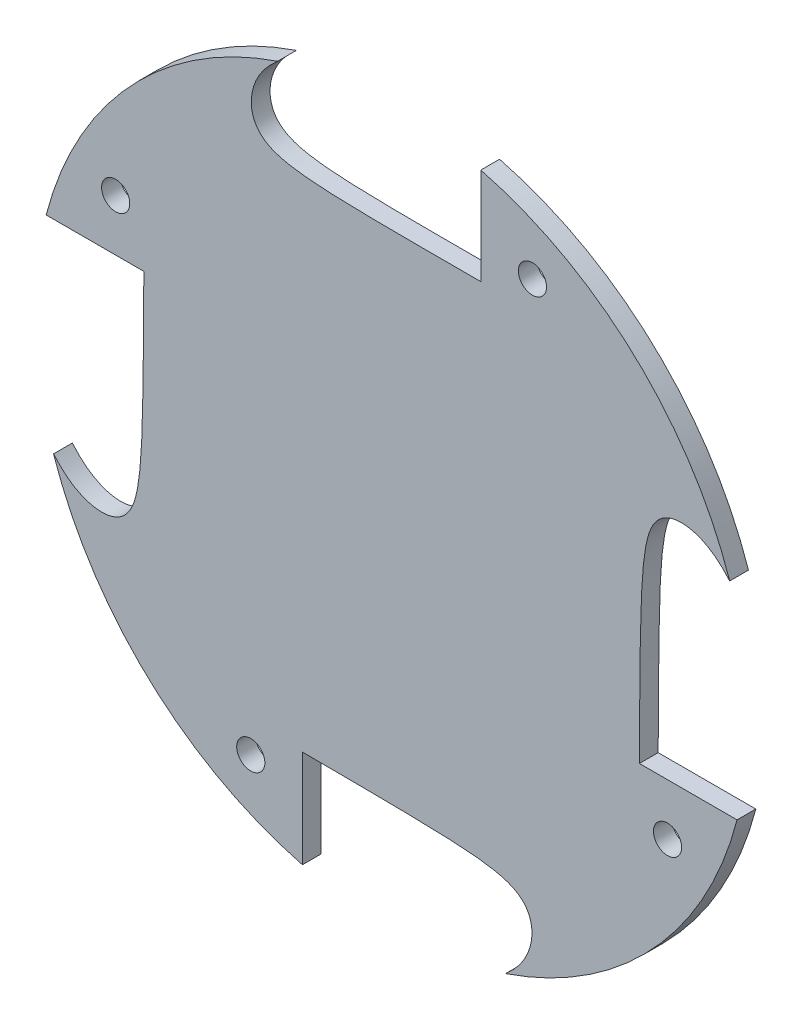
ISO-10303-21;
HEADER;
FILE_DESCRIPTION(('STEP AP214'),'2;1');
FILE_NAME('part.step','',(''),(''),'','','');
FILE_SCHEMA(('AUTOMOTIVE_DESIGN { 1 0 10303 214 1 1 1 1 }'));
ENDSEC;
DATA;
#1=APPLICATION_CONTEXT('core data for automotive mechanical design processes');
#2=APPLICATION_PROTOCOL_DEFINITION('international standard','automotive_design',2000,#1);
#3=PRODUCT_CONTEXT('',#1,'mechanical');
#4=PRODUCT('Part','Part','',(#3));
#5=PRODUCT_RELATED_PRODUCT_CATEGORY('part','',(#4));
#6=PRODUCT_DEFINITION_FORMATION('','',#4);
#7=PRODUCT_DEFINITION_CONTEXT('part definition',#1,'design');
#8=PRODUCT_DEFINITION('design','',#6,#7);
#9=PRODUCT_DEFINITION_SHAPE('','',#8);
#10=(LENGTH_UNIT() NAMED_UNIT(*) SI_UNIT(.MILLI.,.METRE.));
#11=(NAMED_UNIT(*) PLANE_ANGLE_UNIT() SI_UNIT($,.RADIAN.));
#12=(NAMED_UNIT(*) SI_UNIT($,.STERADIAN.) SOLID_ANGLE_UNIT());
#13=UNCERTAINTY_MEASURE_WITH_UNIT(LENGTH_MEASURE(1.E-05),#10,'distance_accuracy_value','');
#14=(GEOMETRIC_REPRESENTATION_CONTEXT(3) GLOBAL_UNCERTAINTY_ASSIGNED_CONTEXT((#13)) GLOBAL_UNIT_ASSIGNED_CONTEXT((#10,
#11,#12)) REPRESENTATION_CONTEXT('',''));
#15=CARTESIAN_POINT('',(0.,0.,0.));
#16=DIRECTION('',(0.,0.,1.));
#17=DIRECTION('',(1.,0.,0.));
#18=AXIS2_PLACEMENT_3D('',#15,#16,#17);
#19=CARTESIAN_POINT('',(24.2809901744275,-72.0168974349032,4.));
#20=CARTESIAN_POINT('',(27.0406670726884,-69.5410863292131,4.));
#21=CARTESIAN_POINT('',(29.0891629376006,-67.4285749685224,4.));
#22=CARTESIAN_POINT('',(30.2414418616137,-64.3558311711541,4.));
#23=CARTESIAN_POINT('',(31.0736433067342,-60.9630098948933,4.));
#24=CARTESIAN_POINT('',(30.5615193405061,-59.0425450215381,4.));
#25=CARTESIAN_POINT('',(29.2171939291575,-56.6739716777334,4.));
#26=CARTESIAN_POINT('',(27.4887755431378,-54.2413828381502,4.));
#27=CARTESIAN_POINT('',(25.1059549538443,-52.9999999999996,4.));
#28=CARTESIAN_POINT('',(17.3743272101338,-52.9999999999997,4.));
#29=CARTESIAN_POINT('',(-18.9999999999992,-52.782560411168,4.));
#30=B_SPLINE_CURVE_WITH_KNOTS('',10,(#19,#20,#21,#22,#23,#24,#25,#26,#27,#28,#29),.UNSPECIFIED.,
.F.,.F.,(11,11),(0.,1.),.UNSPECIFIED.);
#31=DIRECTION('',(0.,0.,-1.));
#32=VECTOR('',#31,1.);
#33=SURFACE_OF_LINEAR_EXTRUSION('',#30,#32);
#34=CARTESIAN_POINT('',(24.2809901744275,-72.0168974349032,0.));
#35=CARTESIAN_POINT('',(27.0406670726884,-69.5410863292131,0.));
#36=CARTESIAN_POINT('',(29.0891629376006,-67.4285749685224,0.));
#37=CARTESIAN_POINT('',(30.2414418616137,-64.3558311711541,0.));
#38=CARTESIAN_POINT('',(31.0736433067342,-60.9630098948933,0.));
#39=CARTESIAN_POINT('',(30.5615193405061,-59.0425450215381,0.));
#40=CARTESIAN_POINT('',(29.2171939291575,-56.6739716777334,0.));
#41=CARTESIAN_POINT('',(27.4887755431378,-54.2413828381502,0.));
#42=CARTESIAN_POINT('',(25.1059549538443,-52.9999999999996,0.));
#43=CARTESIAN_POINT('',(17.3743272101338,-52.9999999999997,0.));
#44=CARTESIAN_POINT('',(-18.9999999999992,-52.782560411168,0.));
#45=B_SPLINE_CURVE_WITH_KNOTS('',10,(#34,#35,#36,#37,#38,#39,#40,#41,#42,#43,#44),.UNSPECIFIED.,
.F.,.F.,(11,11),(0.,1.),.UNSPECIFIED.);
#46=CARTESIAN_POINT('',(24.2809901744275,-72.0168974349032,0.));
#47=VERTEX_POINT('',#46);
#48=CARTESIAN_POINT('',(-18.9999999999992,-52.782560411168,0.));
#49=VERTEX_POINT('',#48);
#50=EDGE_CURVE('E265',#47,#49,#45,.T.);
#51=ORIENTED_EDGE('',*,*,#50,.F.);
#52=DIRECTION('',(0.,0.,-1.));
#53=VECTOR('',#52,1.);
#54=CARTESIAN_POINT('',(24.2809901744275,-72.0168974349032,4.));
#55=LINE('',#54,#53);
#56=CARTESIAN_POINT('',(24.2809901744275,-72.0168974349032,4.));
#57=VERTEX_POINT('',#56);
#58=EDGE_CURVE('E11',#57,#47,#55,.T.);
#59=ORIENTED_EDGE('',*,*,#58,.F.);
#60=CARTESIAN_POINT('',(-18.9999999999992,-52.782560411168,4.));
#61=VERTEX_POINT('',#60);
#62=EDGE_CURVE('E321',#57,#61,#30,.T.);
#63=ORIENTED_EDGE('',*,*,#62,.T.);
#64=DIRECTION('',(0.,0.,-1.));
#65=VECTOR('',#64,1.);
#66=CARTESIAN_POINT('',(-18.9999999999992,-52.782560411168,4.));
#67=LINE('',#66,#65);
#68=EDGE_CURVE('E107',#61,#49,#67,.T.);
#69=ORIENTED_EDGE('',*,*,#68,.T.);
#70=EDGE_LOOP('',(#51,#59,#63,#69));
#71=FACE_BOUND('',#70,.T.);
#72=ADVANCED_FACE('F43',(#71),#33,.T.);
#73=CARTESIAN_POINT('',(0.,0.,4.));
#74=DIRECTION('',(0.,0.,-1.));
#75=DIRECTION('',(-1.,0.,0.));
#76=AXIS2_PLACEMENT_3D('',#73,#74,#75);
#77=CYLINDRICAL_SURFACE('',#76,76.);
#78=CARTESIAN_POINT('',(0.,0.,0.));
#79=DIRECTION('',(0.,0.,1.));
#80=DIRECTION('',(1.,0.,0.));
#81=AXIS2_PLACEMENT_3D('',#78,#79,#80);
#82=CIRCLE('',#81,76.);
#83=CARTESIAN_POINT('',(73.5866835779408,-19.0000000000005,0.));
#84=VERTEX_POINT('',#83);
#85=EDGE_CURVE('E255',#47,#84,#82,.T.);
#86=ORIENTED_EDGE('',*,*,#85,.T.);
#87=DIRECTION('',(0.,0.,-1.));
#88=VECTOR('',#87,1.);
#89=CARTESIAN_POINT('',(73.5866835779408,-19.0000000000005,4.));
#90=LINE('',#89,#88);
#91=CARTESIAN_POINT('',(73.5866835779408,-19.0000000000005,4.));
#92=VERTEX_POINT('',#91);
#93=EDGE_CURVE('E53',#92,#84,#90,.T.);
#94=ORIENTED_EDGE('',*,*,#93,.F.);
#95=CARTESIAN_POINT('',(0.,0.,4.));
#96=DIRECTION('',(0.,0.,1.));
#97=DIRECTION('',(1.,0.,0.));
#98=AXIS2_PLACEMENT_3D('',#95,#96,#97);
#99=CIRCLE('',#98,76.);
#100=EDGE_CURVE('E411',#57,#92,#99,.T.);
#101=ORIENTED_EDGE('',*,*,#100,.F.);
#102=ORIENTED_EDGE('',*,*,#58,.T.);
#103=EDGE_LOOP('',(#86,#94,#101,#102));
#104=FACE_BOUND('',#103,.T.);
#105=ADVANCED_FACE('F374',(#104),#77,.T.);
#106=CARTESIAN_POINT('',(0.,-19.0000000000005,4.));
#107=DIRECTION('',(0.,-1.,0.));
#108=DIRECTION('',(0.,0.,-1.));
#109=AXIS2_PLACEMENT_3D('',#106,#107,#108);
#110=PLANE('',#109);
#111=DIRECTION('',(-1.,0.,0.));
#112=VECTOR('',#111,1.);
#113=CARTESIAN_POINT('',(0.,-19.0000000000005,0.));
#114=LINE('',#113,#112);
#115=CARTESIAN_POINT('',(52.7825604111679,-19.0000000000005,0.));
#116=VERTEX_POINT('',#115);
#117=EDGE_CURVE('E246',#84,#116,#114,.T.);
#118=ORIENTED_EDGE('',*,*,#117,.T.);
#119=DIRECTION('',(0.,0.,-1.));
#120=VECTOR('',#119,1.);
#121=CARTESIAN_POINT('',(52.7825604111679,-19.0000000000005,4.));
#122=LINE('',#121,#120);
#123=CARTESIAN_POINT('',(52.7825604111679,-19.0000000000005,4.));
#124=VERTEX_POINT('',#123);
#125=EDGE_CURVE('E235',#124,#116,#122,.T.);
#126=ORIENTED_EDGE('',*,*,#125,.F.);
#127=DIRECTION('',(-1.,0.,0.));
#128=VECTOR('',#127,1.);
#129=CARTESIAN_POINT('',(0.,-19.0000000000005,4.));
#130=LINE('',#129,#128);
#131=EDGE_CURVE('E248',#92,#124,#130,.T.);
#132=ORIENTED_EDGE('',*,*,#131,.F.);
#133=ORIENTED_EDGE('',*,*,#93,.T.);
#134=EDGE_LOOP('',(#118,#126,#132,#133));
#135=FACE_BOUND('',#134,.T.);
#136=ADVANCED_FACE('F244',(#135),#110,.F.);
#137=CARTESIAN_POINT('',(72.0168974349034,24.2809901744259,4.));
#138=CARTESIAN_POINT('',(69.5410863292133,27.0406670726869,4.));
#139=CARTESIAN_POINT('',(67.4285749685226,29.0891629375991,4.));
#140=CARTESIAN_POINT('',(64.3558311711543,30.2414418616122,4.));
#141=CARTESIAN_POINT('',(60.9630098948935,31.0736433067328,4.));
#142=CARTESIAN_POINT('',(59.0425450215383,30.5615193405047,4.));
#143=CARTESIAN_POINT('',(56.6739716777336,29.217193929156,4.));
#144=CARTESIAN_POINT('',(54.2413828381504,27.4887755431363,4.));
#145=CARTESIAN_POINT('',(52.9999999999998,25.1059549538429,4.));
#146=CARTESIAN_POINT('',(52.9999999999999,17.3743272101324,4.));
#147=CARTESIAN_POINT('',(52.7825604111679,-19.0000000000005,4.));
#148=B_SPLINE_CURVE_WITH_KNOTS('',10,(#137,#138,#139,#140,#141,#142,#143,#144,#145,#146,#147),
.UNSPECIFIED.,.F.,.F.,(11,11),(0.,1.),.UNSPECIFIED.);
#149=DIRECTION('',(0.,0.,-1.));
#150=VECTOR('',#149,1.);
#151=SURFACE_OF_LINEAR_EXTRUSION('',#148,#150);
#152=CARTESIAN_POINT('',(72.0168974349034,24.2809901744259,0.));
#153=CARTESIAN_POINT('',(69.5410863292133,27.0406670726869,0.));
#154=CARTESIAN_POINT('',(67.4285749685226,29.0891629375991,0.));
#155=CARTESIAN_POINT('',(64.3558311711543,30.2414418616122,0.));
#156=CARTESIAN_POINT('',(60.9630098948935,31.0736433067328,0.));
#157=CARTESIAN_POINT('',(59.0425450215383,30.5615193405047,0.));
#158=CARTESIAN_POINT('',(56.6739716777336,29.217193929156,0.));
#159=CARTESIAN_POINT('',(54.2413828381504,27.4887755431363,0.));
#160=CARTESIAN_POINT('',(52.9999999999998,25.1059549538429,0.));
#161=CARTESIAN_POINT('',(52.9999999999999,17.3743272101324,0.));
#162=CARTESIAN_POINT('',(52.7825604111679,-19.0000000000005,0.));
#163=B_SPLINE_CURVE_WITH_KNOTS('',10,(#152,#153,#154,#155,#156,#157,#158,#159,#160,#161,#162),
.UNSPECIFIED.,.F.,.F.,(11,11),(0.,1.),.UNSPECIFIED.);
#164=CARTESIAN_POINT('',(72.0168974349035,24.280990174426,0.));
#165=VERTEX_POINT('',#164);
#166=EDGE_CURVE('E258',#165,#116,#163,.T.);
#167=ORIENTED_EDGE('',*,*,#166,.F.);
#168=DIRECTION('',(0.,0.,-1.));
#169=VECTOR('',#168,1.);
#170=CARTESIAN_POINT('',(72.0168974349035,24.280990174426,4.));
#171=LINE('',#170,#169);
#172=CARTESIAN_POINT('',(72.0168974349035,24.280990174426,4.));
#173=VERTEX_POINT('',#172);
#174=EDGE_CURVE('E232',#173,#165,#171,.T.);
#175=ORIENTED_EDGE('',*,*,#174,.F.);
#176=EDGE_CURVE('E388',#173,#124,#148,.T.);
#177=ORIENTED_EDGE('',*,*,#176,.T.);
#178=ORIENTED_EDGE('',*,*,#125,.T.);
#179=EDGE_LOOP('',(#167,#175,#177,#178));
#180=FACE_BOUND('',#179,.T.);
#181=ADVANCED_FACE('F381',(#180),#151,.T.);
#182=CARTESIAN_POINT('',(0.,0.,4.));
#183=DIRECTION('',(0.,0.,-1.));
#184=DIRECTION('',(-1.,0.,0.));
#185=AXIS2_PLACEMENT_3D('',#182,#183,#184);
#186=CYLINDRICAL_SURFACE('',#185,75.9999999999999);
#187=CARTESIAN_POINT('',(0.,0.,0.));
#188=DIRECTION('',(0.,0.,1.));
#189=DIRECTION('',(1.,0.,0.));
#190=AXIS2_PLACEMENT_3D('',#187,#188,#189);
#191=CIRCLE('',#190,75.9999999999999);
#192=CARTESIAN_POINT('',(19.0000000000008,73.5866835779407,0.));
#193=VERTEX_POINT('',#192);
#194=EDGE_CURVE('E263',#165,#193,#191,.T.);
#195=ORIENTED_EDGE('',*,*,#194,.T.);
#196=DIRECTION('',(0.,0.,-1.));
#197=VECTOR('',#196,1.);
#198=CARTESIAN_POINT('',(19.0000000000008,73.5866835779407,4.));
#199=LINE('',#198,#197);
#200=CARTESIAN_POINT('',(19.0000000000008,73.5866835779407,4.));
#201=VERTEX_POINT('',#200);
#202=EDGE_CURVE('E228',#201,#193,#199,.T.);
#203=ORIENTED_EDGE('',*,*,#202,.F.);
#204=CARTESIAN_POINT('',(0.,0.,4.));
#205=DIRECTION('',(0.,0.,1.));
#206=DIRECTION('',(1.,0.,0.));
#207=AXIS2_PLACEMENT_3D('',#204,#205,#206);
#208=CIRCLE('',#207,75.9999999999999);
#209=EDGE_CURVE('E395',#173,#201,#208,.T.);
#210=ORIENTED_EDGE('',*,*,#209,.F.);
#211=ORIENTED_EDGE('',*,*,#174,.T.);
#212=EDGE_LOOP('',(#195,#203,#210,#211));
#213=FACE_BOUND('',#212,.T.);
#214=ADVANCED_FACE('F386',(#213),#186,.T.);
#215=CARTESIAN_POINT('',(19.0000000000008,0.,4.));
#216=DIRECTION('',(1.,0.,0.));
#217=DIRECTION('',(0.,0.,-1.));
#218=AXIS2_PLACEMENT_3D('',#215,#216,#217);
#219=PLANE('',#218);
#220=DIRECTION('',(0.,-1.,0.));
#221=VECTOR('',#220,1.);
#222=CARTESIAN_POINT('',(19.0000000000008,0.,0.));
#223=LINE('',#222,#221);
#224=CARTESIAN_POINT('',(19.0000000000008,53.,0.));
#225=VERTEX_POINT('',#224);
#226=EDGE_CURVE('E276',#193,#225,#223,.T.);
#227=ORIENTED_EDGE('',*,*,#226,.T.);
#228=DIRECTION('',(0.,0.,-1.));
#229=VECTOR('',#228,1.);
#230=CARTESIAN_POINT('',(19.0000000000008,53.,4.));
#231=LINE('',#230,#229);
#232=CARTESIAN_POINT('',(19.0000000000008,53.,4.));
#233=VERTEX_POINT('',#232);
#234=EDGE_CURVE('E225',#233,#225,#231,.T.);
#235=ORIENTED_EDGE('',*,*,#234,.F.);
#236=DIRECTION('',(0.,-1.,0.));
#237=VECTOR('',#236,1.);
#238=CARTESIAN_POINT('',(19.0000000000008,0.,4.));
#239=LINE('',#238,#237);
#240=EDGE_CURVE('E200',#201,#233,#239,.T.);
#241=ORIENTED_EDGE('',*,*,#240,.F.);
#242=ORIENTED_EDGE('',*,*,#202,.T.);
#243=EDGE_LOOP('',(#227,#235,#241,#242));
#244=FACE_BOUND('',#243,.T.);
#245=ADVANCED_FACE('F190',(#244),#219,.F.);
#246=CARTESIAN_POINT('',(-24.2809901744262,72.0168974349036,4.));
#247=CARTESIAN_POINT('',(-27.0406670726872,69.5410863292135,4.));
#248=CARTESIAN_POINT('',(-29.0891629375994,67.4285749685228,4.));
#249=CARTESIAN_POINT('',(-30.2414418616125,64.3558311711545,4.));
#250=CARTESIAN_POINT('',(-31.073643306733,60.9630098948937,4.));
#251=CARTESIAN_POINT('',(-30.561519340505,59.0425450215385,4.));
#252=CARTESIAN_POINT('',(-29.2171939291564,56.6739716777338,4.));
#253=CARTESIAN_POINT('',(-27.4887755431367,54.2413828381506,4.));
#254=CARTESIAN_POINT('',(-25.1059549538432,53.,4.));
#255=CARTESIAN_POINT('',(-17.3743272101327,53.,4.));
#256=CARTESIAN_POINT('',(19.0000000000008,53.,4.));
#257=B_SPLINE_CURVE_WITH_KNOTS('',10,(#246,#247,#248,#249,#250,#251,#252,#253,#254,#255,#256),
.UNSPECIFIED.,.F.,.F.,(11,11),(0.,1.),.UNSPECIFIED.);
#258=DIRECTION('',(0.,0.,-1.));
#259=VECTOR('',#258,1.);
#260=SURFACE_OF_LINEAR_EXTRUSION('',#257,#259);
#261=CARTESIAN_POINT('',(-24.2809901744262,72.0168974349036,0.));
#262=CARTESIAN_POINT('',(-27.0406670726872,69.5410863292135,0.));
#263=CARTESIAN_POINT('',(-29.0891629375994,67.4285749685228,0.));
#264=CARTESIAN_POINT('',(-30.2414418616125,64.3558311711545,0.));
#265=CARTESIAN_POINT('',(-31.073643306733,60.9630098948937,0.));
#266=CARTESIAN_POINT('',(-30.561519340505,59.0425450215385,0.));
#267=CARTESIAN_POINT('',(-29.2171939291564,56.6739716777338,0.));
#268=CARTESIAN_POINT('',(-27.4887755431367,54.2413828381506,0.));
#269=CARTESIAN_POINT('',(-25.1059549538432,53.,0.));
#270=CARTESIAN_POINT('',(-17.3743272101327,53.,0.));
#271=CARTESIAN_POINT('',(19.0000000000008,53.,0.));
#272=B_SPLINE_CURVE_WITH_KNOTS('',10,(#261,#262,#263,#264,#265,#266,#267,#268,#269,#270,#271),
.UNSPECIFIED.,.F.,.F.,(11,11),(0.,1.),.UNSPECIFIED.);
#273=CARTESIAN_POINT('',(-24.2809901744262,72.0168974349036,0.));
#274=VERTEX_POINT('',#273);
#275=EDGE_CURVE('E280',#274,#225,#272,.T.);
#276=ORIENTED_EDGE('',*,*,#275,.F.);
#277=DIRECTION('',(0.,0.,-1.));
#278=VECTOR('',#277,1.);
#279=CARTESIAN_POINT('',(-24.2809901744262,72.0168974349036,4.));
#280=LINE('',#279,#278);
#281=CARTESIAN_POINT('',(-24.2809901744262,72.0168974349036,4.));
#282=VERTEX_POINT('',#281);
#283=EDGE_CURVE('E216',#282,#274,#280,.T.);
#284=ORIENTED_EDGE('',*,*,#283,.F.);
#285=EDGE_CURVE('E193',#282,#233,#257,.T.);
#286=ORIENTED_EDGE('',*,*,#285,.T.);
#287=ORIENTED_EDGE('',*,*,#234,.T.);
#288=EDGE_LOOP('',(#276,#284,#286,#287));
#289=FACE_BOUND('',#288,.T.);
#290=ADVANCED_FACE('F185',(#289),#260,.T.);
#291=CARTESIAN_POINT('',(0.,0.,4.));
#292=DIRECTION('',(0.,0.,-1.));
#293=DIRECTION('',(-1.,0.,0.));
#294=AXIS2_PLACEMENT_3D('',#291,#292,#293);
#295=CYLINDRICAL_SURFACE('',#294,76.);
#296=CARTESIAN_POINT('',(0.,0.,0.));
#297=DIRECTION('',(0.,0.,1.));
#298=DIRECTION('',(1.,0.,0.));
#299=AXIS2_PLACEMENT_3D('',#296,#297,#298);
#300=CIRCLE('',#299,76.);
#301=CARTESIAN_POINT('',(-73.5866835779411,18.9999999999995,0.));
#302=VERTEX_POINT('',#301);
#303=EDGE_CURVE('E212',#274,#302,#300,.T.);
#304=ORIENTED_EDGE('',*,*,#303,.T.);
#305=DIRECTION('',(0.,0.,-1.));
#306=VECTOR('',#305,1.);
#307=CARTESIAN_POINT('',(-73.5866835779411,18.9999999999995,4.));
#308=LINE('',#307,#306);
#309=CARTESIAN_POINT('',(-73.5866835779411,18.9999999999995,4.));
#310=VERTEX_POINT('',#309);
#311=EDGE_CURVE('E210',#310,#302,#308,.T.);
#312=ORIENTED_EDGE('',*,*,#311,.F.);
#313=CARTESIAN_POINT('',(0.,0.,4.));
#314=DIRECTION('',(0.,0.,1.));
#315=DIRECTION('',(1.,0.,0.));
#316=AXIS2_PLACEMENT_3D('',#313,#314,#315);
#317=CIRCLE('',#316,76.);
#318=EDGE_CURVE('E163',#282,#310,#317,.T.);
#319=ORIENTED_EDGE('',*,*,#318,.F.);
#320=ORIENTED_EDGE('',*,*,#283,.T.);
#321=EDGE_LOOP('',(#304,#312,#319,#320));
#322=FACE_BOUND('',#321,.T.);
#323=ADVANCED_FACE('F181',(#322),#295,.T.);
#324=CARTESIAN_POINT('',(0.,18.9999999999995,4.));
#325=DIRECTION('',(0.,1.,0.));
#326=DIRECTION('',(0.,0.,1.));
#327=AXIS2_PLACEMENT_3D('',#324,#325,#326);
#328=PLANE('',#327);
#329=DIRECTION('',(1.,0.,0.));
#330=VECTOR('',#329,1.);
#331=CARTESIAN_POINT('',(0.,18.9999999999995,0.));
#332=LINE('',#331,#330);
#333=CARTESIAN_POINT('',(-52.7825604111669,18.9999999999995,0.));
#334=VERTEX_POINT('',#333);
#335=EDGE_CURVE('E218',#302,#334,#332,.T.);
#336=ORIENTED_EDGE('',*,*,#335,.T.);
#337=DIRECTION('',(0.,0.,-1.));
#338=VECTOR('',#337,1.);
#339=CARTESIAN_POINT('',(-52.7825604111669,18.9999999999995,4.));
#340=LINE('',#339,#338);
#341=CARTESIAN_POINT('',(-52.7825604111669,18.9999999999995,4.));
#342=VERTEX_POINT('',#341);
#343=EDGE_CURVE('E148',#342,#334,#340,.T.);
#344=ORIENTED_EDGE('',*,*,#343,.F.);
#345=DIRECTION('',(1.,0.,0.));
#346=VECTOR('',#345,1.);
#347=CARTESIAN_POINT('',(0.,18.9999999999995,4.));
#348=LINE('',#347,#346);
#349=EDGE_CURVE('E158',#310,#342,#348,.T.);
#350=ORIENTED_EDGE('',*,*,#349,.F.);
#351=ORIENTED_EDGE('',*,*,#311,.T.);
#352=EDGE_LOOP('',(#336,#344,#350,#351));
#353=FACE_BOUND('',#352,.T.);
#354=ADVANCED_FACE('F177',(#353),#328,.F.);
#355=CARTESIAN_POINT('',(-72.0168974349025,-24.2809901744264,4.));
#356=CARTESIAN_POINT('',(-69.5410863292124,-27.0406670726874,4.));
#357=CARTESIAN_POINT('',(-67.4285749685217,-29.0891629375996,4.));
#358=CARTESIAN_POINT('',(-64.3558311711534,-30.2414418616126,4.));
#359=CARTESIAN_POINT('',(-60.9630098948926,-31.0736433067332,4.));
#360=CARTESIAN_POINT('',(-59.0425450215374,-30.5615193405052,4.));
#361=CARTESIAN_POINT('',(-56.6739716777327,-29.2171939291566,4.));
#362=CARTESIAN_POINT('',(-54.2413828381494,-27.4887755431368,4.));
#363=CARTESIAN_POINT('',(-52.9999999999989,-25.1059549538434,4.));
#364=CARTESIAN_POINT('',(-52.9999999999989,-17.3743272101329,4.));
#365=CARTESIAN_POINT('',(-52.7825604111669,18.9999999999995,4.));
#366=B_SPLINE_CURVE_WITH_KNOTS('',10,(#355,#356,#357,#358,#359,#360,#361,#362,#363,#364,#365),
.UNSPECIFIED.,.F.,.F.,(11,11),(0.,1.),.UNSPECIFIED.);
#367=DIRECTION('',(0.,0.,-1.));
#368=VECTOR('',#367,1.);
#369=SURFACE_OF_LINEAR_EXTRUSION('',#366,#368);
#370=CARTESIAN_POINT('',(-72.0168974349025,-24.2809901744264,0.));
#371=CARTESIAN_POINT('',(-69.5410863292124,-27.0406670726874,0.));
#372=CARTESIAN_POINT('',(-67.4285749685217,-29.0891629375996,0.));
#373=CARTESIAN_POINT('',(-64.3558311711534,-30.2414418616126,0.));
#374=CARTESIAN_POINT('',(-60.9630098948926,-31.0736433067332,0.));
#375=CARTESIAN_POINT('',(-59.0425450215374,-30.5615193405052,0.));
#376=CARTESIAN_POINT('',(-56.6739716777327,-29.2171939291566,0.));
#377=CARTESIAN_POINT('',(-54.2413828381494,-27.4887755431368,0.));
#378=CARTESIAN_POINT('',(-52.9999999999989,-25.1059549538434,0.));
#379=CARTESIAN_POINT('',(-52.9999999999989,-17.3743272101329,0.));
#380=CARTESIAN_POINT('',(-52.7825604111669,18.9999999999995,0.));
#381=B_SPLINE_CURVE_WITH_KNOTS('',10,(#370,#371,#372,#373,#374,#375,#376,#377,#378,#379,#380),
.UNSPECIFIED.,.F.,.F.,(11,11),(0.,1.),.UNSPECIFIED.);
#382=CARTESIAN_POINT('',(-72.0168974349029,-24.2809901744265,0.));
#383=VERTEX_POINT('',#382);
#384=EDGE_CURVE('E146',#383,#334,#381,.T.);
#385=ORIENTED_EDGE('',*,*,#384,.F.);
#386=DIRECTION('',(0.,0.,-1.));
#387=VECTOR('',#386,1.);
#388=CARTESIAN_POINT('',(-72.0168974349029,-24.2809901744265,4.));
#389=LINE('',#388,#387);
#390=CARTESIAN_POINT('',(-72.0168974349029,-24.2809901744265,4.));
#391=VERTEX_POINT('',#390);
#392=EDGE_CURVE('E140',#391,#383,#389,.T.);
#393=ORIENTED_EDGE('',*,*,#392,.F.);
#394=EDGE_CURVE('E144',#391,#342,#366,.T.);
#395=ORIENTED_EDGE('',*,*,#394,.T.);
#396=ORIENTED_EDGE('',*,*,#343,.T.);
#397=EDGE_LOOP('',(#385,#393,#395,#396));
#398=FACE_BOUND('',#397,.T.);
#399=ADVANCED_FACE('F142',(#398),#369,.T.);
#400=CARTESIAN_POINT('',(0.,0.,4.));
#401=DIRECTION('',(0.,0.,-1.));
#402=DIRECTION('',(-1.,0.,0.));
#403=AXIS2_PLACEMENT_3D('',#400,#401,#402);
#404=CYLINDRICAL_SURFACE('',#403,75.9999999999995);
#405=CARTESIAN_POINT('',(0.,0.,0.));
#406=DIRECTION('',(0.,0.,1.));
#407=DIRECTION('',(1.,0.,0.));
#408=AXIS2_PLACEMENT_3D('',#405,#406,#407);
#409=CIRCLE('',#408,75.9999999999995);
#410=CARTESIAN_POINT('',(-18.9999999999992,-73.5866835779411,0.));
#411=VERTEX_POINT('',#410);
#412=EDGE_CURVE('E100',#383,#411,#409,.T.);
#413=ORIENTED_EDGE('',*,*,#412,.T.);
#414=DIRECTION('',(0.,0.,-1.));
#415=VECTOR('',#414,1.);
#416=CARTESIAN_POINT('',(-18.9999999999992,-73.5866835779411,4.));
#417=LINE('',#416,#415);
#418=CARTESIAN_POINT('',(-18.9999999999992,-73.5866835779411,4.));
#419=VERTEX_POINT('',#418);
#420=EDGE_CURVE('E149',#419,#411,#417,.T.);
#421=ORIENTED_EDGE('',*,*,#420,.F.);
#422=CARTESIAN_POINT('',(0.,0.,4.));
#423=DIRECTION('',(0.,0.,1.));
#424=DIRECTION('',(1.,0.,0.));
#425=AXIS2_PLACEMENT_3D('',#422,#423,#424);
#426=CIRCLE('',#425,75.9999999999995);
#427=EDGE_CURVE('E151',#391,#419,#426,.T.);
#428=ORIENTED_EDGE('',*,*,#427,.F.);
#429=ORIENTED_EDGE('',*,*,#392,.T.);
#430=EDGE_LOOP('',(#413,#421,#428,#429));
#431=FACE_BOUND('',#430,.T.);
#432=ADVANCED_FACE('F152',(#431),#404,.T.);
#433=CARTESIAN_POINT('',(58.7825604111679,-29.9999999999995,4.));
#434=DIRECTION('',(0.,0.,-1.));
#435=DIRECTION('',(-1.,0.,0.));
#436=AXIS2_PLACEMENT_3D('',#433,#434,#435);
#437=CYLINDRICAL_SURFACE('',#436,3.00000000000001);
#438=CARTESIAN_POINT('',(58.7825604111679,-29.9999999999995,4.));
#439=DIRECTION('',(0.,0.,1.));
#440=DIRECTION('',(1.,0.,0.));
#441=AXIS2_PLACEMENT_3D('',#438,#439,#440);
#442=CIRCLE('',#441,3.00000000000001);
#443=CARTESIAN_POINT('',(61.7825604111679,-29.9999999999995,4.));
#444=VERTEX_POINT('',#443);
#445=EDGE_CURVE('E338',#444,#444,#442,.T.);
#446=ORIENTED_EDGE('',*,*,#445,.T.);
#447=EDGE_LOOP('',(#446));
#448=FACE_BOUND('',#447,.T.);
#449=CARTESIAN_POINT('',(58.7825604111679,-29.9999999999995,0.));
#450=DIRECTION('',(0.,0.,1.));
#451=DIRECTION('',(1.,0.,0.));
#452=AXIS2_PLACEMENT_3D('',#449,#450,#451);
#453=CIRCLE('',#452,3.00000000000001);
#454=CARTESIAN_POINT('',(61.7825604111679,-29.9999999999995,0.));
#455=VERTEX_POINT('',#454);
#456=EDGE_CURVE('E313',#455,#455,#453,.T.);
#457=ORIENTED_EDGE('',*,*,#456,.F.);
#458=EDGE_LOOP('',(#457));
#459=FACE_BOUND('',#458,.T.);
#460=ADVANCED_FACE('F449',(#448,#459),#437,.F.);
#461=CARTESIAN_POINT('',(-58.7825604111669,29.9999999999995,4.));
#462=DIRECTION('',(0.,0.,-1.));
#463=DIRECTION('',(-1.,0.,0.));
#464=AXIS2_PLACEMENT_3D('',#461,#462,#463);
#465=CYLINDRICAL_SURFACE('',#464,3.);
#466=CARTESIAN_POINT('',(-58.7825604111669,29.9999999999995,4.));
#467=DIRECTION('',(0.,0.,1.));
#468=DIRECTION('',(1.,0.,0.));
#469=AXIS2_PLACEMENT_3D('',#466,#467,#468);
#470=CIRCLE('',#469,3.);
#471=CARTESIAN_POINT('',(-55.7825604111669,29.9999999999995,4.));
#472=VERTEX_POINT('',#471);
#473=EDGE_CURVE('E342',#472,#472,#470,.T.);
#474=ORIENTED_EDGE('',*,*,#473,.T.);
#475=EDGE_LOOP('',(#474));
#476=FACE_BOUND('',#475,.T.);
#477=CARTESIAN_POINT('',(-58.7825604111669,29.9999999999995,0.));
#478=DIRECTION('',(0.,0.,1.));
#479=DIRECTION('',(1.,0.,0.));
#480=AXIS2_PLACEMENT_3D('',#477,#478,#479);
#481=CIRCLE('',#480,3.);
#482=CARTESIAN_POINT('',(-55.7825604111669,29.9999999999995,0.));
#483=VERTEX_POINT('',#482);
#484=EDGE_CURVE('E309',#483,#483,#481,.T.);
#485=ORIENTED_EDGE('',*,*,#484,.F.);
#486=EDGE_LOOP('',(#485));
#487=FACE_BOUND('',#486,.T.);
#488=ADVANCED_FACE('F455',(#476,#487),#465,.F.);
#489=CARTESIAN_POINT('',(30.,59.,4.));
#490=DIRECTION('',(0.,0.,-1.));
#491=DIRECTION('',(-1.,0.,0.));
#492=AXIS2_PLACEMENT_3D('',#489,#490,#491);
#493=CYLINDRICAL_SURFACE('',#492,3.);
#494=CARTESIAN_POINT('',(30.,59.,4.));
#495=DIRECTION('',(0.,0.,1.));
#496=DIRECTION('',(1.,0.,0.));
#497=AXIS2_PLACEMENT_3D('',#494,#495,#496);
#498=CIRCLE('',#497,3.);
#499=CARTESIAN_POINT('',(33.,59.,4.));
#500=VERTEX_POINT('',#499);
#501=EDGE_CURVE('E346',#500,#500,#498,.T.);
#502=ORIENTED_EDGE('',*,*,#501,.T.);
#503=EDGE_LOOP('',(#502));
#504=FACE_BOUND('',#503,.T.);
#505=CARTESIAN_POINT('',(30.,59.,0.));
#506=DIRECTION('',(0.,0.,1.));
#507=DIRECTION('',(1.,0.,0.));
#508=AXIS2_PLACEMENT_3D('',#505,#506,#507);
#509=CIRCLE('',#508,3.);
#510=CARTESIAN_POINT('',(33.,59.,0.));
#511=VERTEX_POINT('',#510);
#512=EDGE_CURVE('E305',#511,#511,#509,.T.);
#513=ORIENTED_EDGE('',*,*,#512,.F.);
#514=EDGE_LOOP('',(#513));
#515=FACE_BOUND('',#514,.T.);
#516=ADVANCED_FACE('F352',(#504,#515),#493,.F.);
#517=CARTESIAN_POINT('',(-18.9999999999992,0.,4.));
#518=DIRECTION('',(-1.,0.,0.));
#519=DIRECTION('',(0.,0.,1.));
#520=AXIS2_PLACEMENT_3D('',#517,#518,#519);
#521=PLANE('',#520);
#522=DIRECTION('',(0.,1.,0.));
#523=VECTOR('',#522,1.);
#524=CARTESIAN_POINT('',(-18.9999999999992,0.,0.));
#525=LINE('',#524,#523);
#526=EDGE_CURVE('E302',#411,#49,#525,.T.);
#527=ORIENTED_EDGE('',*,*,#526,.T.);
#528=ORIENTED_EDGE('',*,*,#68,.F.);
#529=DIRECTION('',(0.,1.,0.));
#530=VECTOR('',#529,1.);
#531=CARTESIAN_POINT('',(-18.9999999999992,0.,4.));
#532=LINE('',#531,#530);
#533=EDGE_CURVE('E61',#419,#61,#532,.T.);
#534=ORIENTED_EDGE('',*,*,#533,.F.);
#535=ORIENTED_EDGE('',*,*,#420,.T.);
#536=EDGE_LOOP('',(#527,#528,#534,#535));
#537=FACE_BOUND('',#536,.T.);
#538=ADVANCED_FACE('F327',(#537),#521,.F.);
#539=CARTESIAN_POINT('',(-30.0000000000008,-58.782560411168,4.));
#540=DIRECTION('',(0.,0.,-1.));
#541=DIRECTION('',(-1.,0.,0.));
#542=AXIS2_PLACEMENT_3D('',#539,#540,#541);
#543=CYLINDRICAL_SURFACE('',#542,3.);
#544=CARTESIAN_POINT('',(-30.0000000000008,-58.782560411168,4.));
#545=DIRECTION('',(0.,0.,1.));
#546=DIRECTION('',(1.,0.,0.));
#547=AXIS2_PLACEMENT_3D('',#544,#545,#546);
#548=CIRCLE('',#547,3.);
#549=CARTESIAN_POINT('',(-27.0000000000008,-58.782560411168,4.));
#550=VERTEX_POINT('',#549);
#551=EDGE_CURVE('E323',#550,#550,#548,.T.);
#552=ORIENTED_EDGE('',*,*,#551,.T.);
#553=EDGE_LOOP('',(#552));
#554=FACE_BOUND('',#553,.T.);
#555=CARTESIAN_POINT('',(-30.0000000000008,-58.782560411168,0.));
#556=DIRECTION('',(0.,0.,1.));
#557=DIRECTION('',(1.,0.,0.));
#558=AXIS2_PLACEMENT_3D('',#555,#556,#557);
#559=CIRCLE('',#558,3.);
#560=CARTESIAN_POINT('',(-27.0000000000008,-58.782560411168,0.));
#561=VERTEX_POINT('',#560);
#562=EDGE_CURVE('E317',#561,#561,#559,.T.);
#563=ORIENTED_EDGE('',*,*,#562,.F.);
#564=EDGE_LOOP('',(#563));
#565=FACE_BOUND('',#564,.T.);
#566=ADVANCED_FACE('F356',(#554,#565),#543,.F.);
#567=CARTESIAN_POINT('',(0.,0.,4.));
#568=DIRECTION('',(0.,0.,1.));
#569=DIRECTION('',(1.,0.,0.));
#570=AXIS2_PLACEMENT_3D('',#567,#568,#569);
#571=PLANE('',#570);
#572=ORIENTED_EDGE('',*,*,#62,.F.);
#573=ORIENTED_EDGE('',*,*,#100,.T.);
#574=ORIENTED_EDGE('',*,*,#131,.T.);
#575=ORIENTED_EDGE('',*,*,#176,.F.);
#576=ORIENTED_EDGE('',*,*,#209,.T.);
#577=ORIENTED_EDGE('',*,*,#240,.T.);
#578=ORIENTED_EDGE('',*,*,#285,.F.);
#579=ORIENTED_EDGE('',*,*,#318,.T.);
#580=ORIENTED_EDGE('',*,*,#349,.T.);
#581=ORIENTED_EDGE('',*,*,#394,.F.);
#582=ORIENTED_EDGE('',*,*,#427,.T.);
#583=ORIENTED_EDGE('',*,*,#533,.T.);
#584=EDGE_LOOP('',(#572,#573,#574,#575,#576,#577,#578,#579,#580,#581,#582,#583));
#585=FACE_BOUND('',#584,.T.);
#586=ORIENTED_EDGE('',*,*,#501,.F.);
#587=EDGE_LOOP('',(#586));
#588=FACE_BOUND('',#587,.T.);
#589=ORIENTED_EDGE('',*,*,#473,.F.);
#590=EDGE_LOOP('',(#589));
#591=FACE_BOUND('',#590,.T.);
#592=ORIENTED_EDGE('',*,*,#445,.F.);
#593=EDGE_LOOP('',(#592));
#594=FACE_BOUND('',#593,.T.);
#595=ORIENTED_EDGE('',*,*,#551,.F.);
#596=EDGE_LOOP('',(#595));
#597=FACE_BOUND('',#596,.T.);
#598=ADVANCED_FACE('F155',(#585,#588,#591,#594,#597),#571,.T.);
#599=CARTESIAN_POINT('',(0.,0.,0.));
#600=DIRECTION('',(0.,0.,1.));
#601=DIRECTION('',(1.,0.,0.));
#602=AXIS2_PLACEMENT_3D('',#599,#600,#601);
#603=PLANE('',#602);
#604=ORIENTED_EDGE('',*,*,#50,.T.);
#605=ORIENTED_EDGE('',*,*,#526,.F.);
#606=ORIENTED_EDGE('',*,*,#412,.F.);
#607=ORIENTED_EDGE('',*,*,#384,.T.);
#608=ORIENTED_EDGE('',*,*,#335,.F.);
#609=ORIENTED_EDGE('',*,*,#303,.F.);
#610=ORIENTED_EDGE('',*,*,#275,.T.);
#611=ORIENTED_EDGE('',*,*,#226,.F.);
#612=ORIENTED_EDGE('',*,*,#194,.F.);
#613=ORIENTED_EDGE('',*,*,#166,.T.);
#614=ORIENTED_EDGE('',*,*,#117,.F.);
#615=ORIENTED_EDGE('',*,*,#85,.F.);
#616=EDGE_LOOP('',(#604,#605,#606,#607,#608,#609,#610,#611,#612,#613,#614,#615));
#617=FACE_BOUND('',#616,.T.);
#618=ORIENTED_EDGE('',*,*,#512,.T.);
#619=EDGE_LOOP('',(#618));
#620=FACE_BOUND('',#619,.T.);
#621=ORIENTED_EDGE('',*,*,#484,.T.);
#622=EDGE_LOOP('',(#621));
#623=FACE_BOUND('',#622,.T.);
#624=ORIENTED_EDGE('',*,*,#456,.T.);
#625=EDGE_LOOP('',(#624));
#626=FACE_BOUND('',#625,.T.);
#627=ORIENTED_EDGE('',*,*,#562,.T.);
#628=EDGE_LOOP('',(#627));
#629=FACE_BOUND('',#628,.T.);
#630=ADVANCED_FACE('F253',(#617,#620,#623,#626,#629),#603,.F.);
#631=CLOSED_SHELL('',(#72,#105,#136,#181,#214,#245,#290,#323,#354,#399,#432,#460,#488,#516,#538,
#566,#598,#630));
#632=MANIFOLD_SOLID_BREP('B2',#631);
#633=ADVANCED_BREP_SHAPE_REPRESENTATION('',(#18,#632),#14);
#634=SHAPE_DEFINITION_REPRESENTATION(#9,#633);
ENDSEC;
END-ISO-10303-21;
